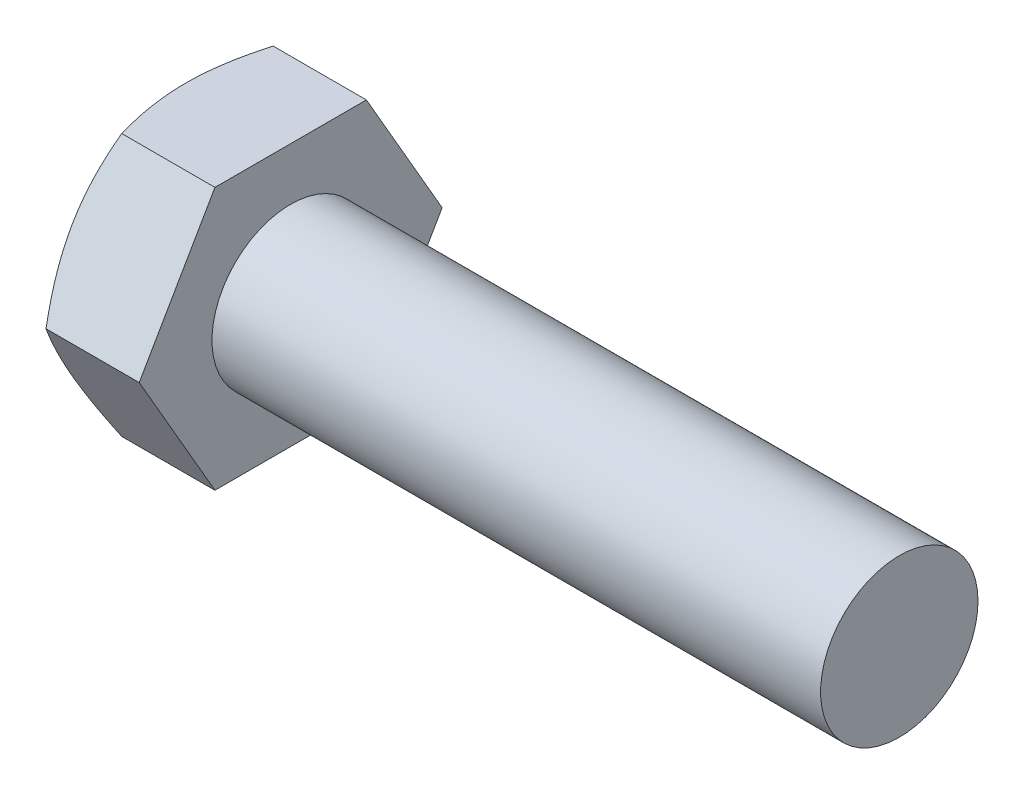
ISO-10303-21;
HEADER;
FILE_DESCRIPTION(('STEP AP214'),'2;1');
FILE_NAME('part.step','',(''),(''),'','','');
FILE_SCHEMA(('AUTOMOTIVE_DESIGN { 1 0 10303 214 1 1 1 1 }'));
ENDSEC;
DATA;
#1=APPLICATION_CONTEXT('core data for automotive mechanical design processes');
#2=APPLICATION_PROTOCOL_DEFINITION('international standard','automotive_design',2000,#1);
#3=PRODUCT_CONTEXT('',#1,'mechanical');
#4=PRODUCT('Part','Part','',(#3));
#5=PRODUCT_RELATED_PRODUCT_CATEGORY('part','',(#4));
#6=PRODUCT_DEFINITION_FORMATION('','',#4);
#7=PRODUCT_DEFINITION_CONTEXT('part definition',#1,'design');
#8=PRODUCT_DEFINITION('design','',#6,#7);
#9=PRODUCT_DEFINITION_SHAPE('','',#8);
#10=(LENGTH_UNIT() NAMED_UNIT(*) SI_UNIT(.MILLI.,.METRE.));
#11=(NAMED_UNIT(*) PLANE_ANGLE_UNIT() SI_UNIT($,.RADIAN.));
#12=(NAMED_UNIT(*) SI_UNIT($,.STERADIAN.) SOLID_ANGLE_UNIT());
#13=UNCERTAINTY_MEASURE_WITH_UNIT(LENGTH_MEASURE(1.E-05),#10,'distance_accuracy_value','');
#14=(GEOMETRIC_REPRESENTATION_CONTEXT(3) GLOBAL_UNCERTAINTY_ASSIGNED_CONTEXT((#13)) GLOBAL_UNIT_ASSIGNED_CONTEXT((#10,
#11,#12)) REPRESENTATION_CONTEXT('',''));
#15=CARTESIAN_POINT('',(0.,0.,0.));
#16=DIRECTION('',(0.,0.,1.));
#17=DIRECTION('',(1.,0.,0.));
#18=AXIS2_PLACEMENT_3D('',#15,#16,#17);
#19=CARTESIAN_POINT('',(23.2,0.,0.));
#20=DIRECTION('',(-1.,0.,0.));
#21=DIRECTION('',(0.,0.,1.));
#22=AXIS2_PLACEMENT_3D('',#19,#20,#21);
#23=CYLINDRICAL_SURFACE('',#22,3.);
#24=CARTESIAN_POINT('',(23.2,0.,0.));
#25=DIRECTION('',(1.,0.,0.));
#26=DIRECTION('',(0.,0.,-1.));
#27=AXIS2_PLACEMENT_3D('',#24,#25,#26);
#28=CIRCLE('',#27,3.);
#29=CARTESIAN_POINT('',(23.2,0.,-3.));
#30=VERTEX_POINT('',#29);
#31=EDGE_CURVE('E150',#30,#30,#28,.T.);
#32=ORIENTED_EDGE('',*,*,#31,.F.);
#33=EDGE_LOOP('',(#32));
#34=FACE_BOUND('',#33,.T.);
#35=CARTESIAN_POINT('',(0.,0.,0.));
#36=DIRECTION('',(1.,0.,0.));
#37=DIRECTION('',(0.,0.,-1.));
#38=AXIS2_PLACEMENT_3D('',#35,#36,#37);
#39=CIRCLE('',#38,3.);
#40=CARTESIAN_POINT('',(0.,0.,-3.));
#41=VERTEX_POINT('',#40);
#42=EDGE_CURVE('E149',#41,#41,#39,.T.);
#43=ORIENTED_EDGE('',*,*,#42,.T.);
#44=EDGE_LOOP('',(#43));
#45=FACE_BOUND('',#44,.T.);
#46=ADVANCED_FACE('F43',(#34,#45),#23,.T.);
#47=CARTESIAN_POINT('',(23.2,0.,0.));
#48=DIRECTION('',(1.,0.,0.));
#49=DIRECTION('',(0.,0.,-1.));
#50=AXIS2_PLACEMENT_3D('',#47,#48,#49);
#51=PLANE('',#50);
#52=ORIENTED_EDGE('',*,*,#31,.T.);
#53=EDGE_LOOP('',(#52));
#54=FACE_BOUND('',#53,.T.);
#55=ADVANCED_FACE('F269',(#54),#51,.T.);
#56=CARTESIAN_POINT('',(-4.,-5.,2.88675134594813));
#57=DIRECTION('',(0.,0.5,-0.866025403784439));
#58=DIRECTION('',(0.,0.866025403784439,0.5));
#59=AXIS2_PLACEMENT_3D('',#56,#57,#58);
#60=PLANE('',#59);
#61=DIRECTION('',(1.,0.,0.));
#62=VECTOR('',#61,1.);
#63=CARTESIAN_POINT('',(-4.,0.,5.77350269189626));
#64=LINE('',#63,#62);
#65=CARTESIAN_POINT('',(-3.5534180126148,0.,5.77350269189626));
#66=VERTEX_POINT('',#65);
#67=CARTESIAN_POINT('',(0.,0.,5.77350269189626));
#68=VERTEX_POINT('',#67);
#69=EDGE_CURVE('E147',#66,#68,#64,.T.);
#70=ORIENTED_EDGE('',*,*,#69,.F.);
#71=CARTESIAN_POINT('',(-3.55335134394818,0.00020000000000018,5.7736181619501));
#72=CARTESIAN_POINT('',(-3.62661343236237,-0.219534594525185,5.64675433465071));
#73=CARTESIAN_POINT('',(-3.69324867808191,-0.44114858445958,5.5188054379059));
#74=CARTESIAN_POINT('',(-3.80956100898919,-0.888213995453513,5.26069210252318));
#75=CARTESIAN_POINT('',(-3.85919695008421,-1.11367335959077,5.13052307794721));
#76=CARTESIAN_POINT('',(-3.9364489745813,-1.56183230522351,4.87177839004641));
#77=CARTESIAN_POINT('',(-3.96457962171651,-1.78446209310419,4.74324302208387));
#78=CARTESIAN_POINT('',(-3.98980507804631,-2.11918990184664,4.54998783160116));
#79=CARTESIAN_POINT('',(-3.99538654023052,-2.23084219680506,4.48552534905128));
#80=CARTESIAN_POINT('',(-4.00079778324853,-2.4542499706738,4.35654081066911));
#81=CARTESIAN_POINT('',(-4.0006277417418,-2.56600544629031,4.2920187567385));
#82=CARTESIAN_POINT('',(-3.99224636820796,-2.87218423085064,4.11524635305244));
#83=CARTESIAN_POINT('',(-3.97817022810275,-3.06650608596721,4.00305457769146));
#84=CARTESIAN_POINT('',(-3.93353474289057,-3.4538601019977,3.77941563226458));
#85=CARTESIAN_POINT('',(-3.90296013985249,-3.64689090137157,3.66796924828419));
#86=CARTESIAN_POINT('',(-3.82653150637884,-4.03502534247485,3.44387972423144));
#87=CARTESIAN_POINT('',(-3.78035362112132,-4.23007999864174,3.3312648659868));
#88=CARTESIAN_POINT('',(-3.67554820550807,-4.61728034535877,3.10771464157941));
#89=CARTESIAN_POINT('',(-3.61694529656263,-4.80943099540809,2.99677641204847));
#90=CARTESIAN_POINT('',(-3.55335134394818,-5.0002,2.88663587589429));
#91=B_SPLINE_CURVE_WITH_KNOTS('',3,(#71,#72,#73,#74,#75,#76,#77,#78,#79,#80,#81,#82,#83,#84,#85,
#86,#87,#88,#89,#90),.UNSPECIFIED.,.F.,.F.,(4,2,2,2,2,2,2,2,2,4),(0.,0.792555841363089,
1.58701660053333,2.3618153748728,2.74884076077325,3.13585419177295,3.80962362599679,
4.48401723901189,5.17336882348929,5.86136694793725),.UNSPECIFIED.);
#92=CARTESIAN_POINT('',(-4.,-2.5,4.33012701892219));
#93=VERTEX_POINT('',#92);
#94=EDGE_CURVE('E131',#66,#93,#91,.T.);
#95=ORIENTED_EDGE('',*,*,#94,.T.);
#96=CARTESIAN_POINT('',(-3.5534180126148,-5.,2.88675134594812));
#97=VERTEX_POINT('',#96);
#98=EDGE_CURVE('E198',#93,#97,#91,.T.);
#99=ORIENTED_EDGE('',*,*,#98,.T.);
#100=DIRECTION('',(1.,0.,0.));
#101=VECTOR('',#100,1.);
#102=CARTESIAN_POINT('',(-4.,-5.,2.88675134594813));
#103=LINE('',#102,#101);
#104=CARTESIAN_POINT('',(0.,-5.,2.88675134594813));
#105=VERTEX_POINT('',#104);
#106=EDGE_CURVE('E142',#97,#105,#103,.T.);
#107=ORIENTED_EDGE('',*,*,#106,.T.);
#108=DIRECTION('',(0.,0.866025403784439,0.5));
#109=VECTOR('',#108,1.);
#110=CARTESIAN_POINT('',(0.,-5.,2.88675134594813));
#111=LINE('',#110,#109);
#112=EDGE_CURVE('E166',#105,#68,#111,.T.);
#113=ORIENTED_EDGE('',*,*,#112,.T.);
#114=EDGE_LOOP('',(#70,#95,#99,#107,#113));
#115=FACE_BOUND('',#114,.T.);
#116=ADVANCED_FACE('F196',(#115),#60,.F.);
#117=CARTESIAN_POINT('',(-4.,0.,5.77350269189626));
#118=DIRECTION('',(0.,-0.5,-0.866025403784439));
#119=DIRECTION('',(0.,0.866025403784439,-0.5));
#120=AXIS2_PLACEMENT_3D('',#117,#118,#119);
#121=PLANE('',#120);
#122=DIRECTION('',(1.,0.,0.));
#123=VECTOR('',#122,1.);
#124=CARTESIAN_POINT('',(-4.,5.,2.88675134594813));
#125=LINE('',#124,#123);
#126=CARTESIAN_POINT('',(-3.5534180126148,5.,2.88675134594812));
#127=VERTEX_POINT('',#126);
#128=CARTESIAN_POINT('',(0.,5.,2.88675134594813));
#129=VERTEX_POINT('',#128);
#130=EDGE_CURVE('E140',#127,#129,#125,.T.);
#131=ORIENTED_EDGE('',*,*,#130,.F.);
#132=CARTESIAN_POINT('',(-3.55335134394818,5.0002,2.88663587589429));
#133=CARTESIAN_POINT('',(-3.62661343236237,4.78046540547482,3.01349970319368));
#134=CARTESIAN_POINT('',(-3.69324867808191,4.55885141554042,3.14144859993849));
#135=CARTESIAN_POINT('',(-3.80956100898919,4.11178600454649,3.39956193532121));
#136=CARTESIAN_POINT('',(-3.85919695008421,3.88632664040923,3.52973095989718));
#137=CARTESIAN_POINT('',(-3.9364489745813,3.43816769477649,3.78847564779798));
#138=CARTESIAN_POINT('',(-3.96457962171651,3.21553790689581,3.91701101576052));
#139=CARTESIAN_POINT('',(-3.98980507804631,2.88081009815336,4.11026620624322));
#140=CARTESIAN_POINT('',(-3.99538654023052,2.76915780319494,4.17472868879311));
#141=CARTESIAN_POINT('',(-4.00079778324853,2.54575002932621,4.30371322717528));
#142=CARTESIAN_POINT('',(-4.0006277417418,2.43399455370969,4.36823528110589));
#143=CARTESIAN_POINT('',(-3.99224636820796,2.12781576914936,4.54500768479194));
#144=CARTESIAN_POINT('',(-3.97817022810275,1.93349391403279,4.65719946015292));
#145=CARTESIAN_POINT('',(-3.93353474289057,1.5461398980023,4.88083840557981));
#146=CARTESIAN_POINT('',(-3.90296013985249,1.35310909862843,4.9922847895602));
#147=CARTESIAN_POINT('',(-3.82653150637884,0.964974657525146,5.21637431361295));
#148=CARTESIAN_POINT('',(-3.78035362112132,0.769920001358265,5.32898917185759));
#149=CARTESIAN_POINT('',(-3.67554820550807,0.382719654641232,5.55253939626498));
#150=CARTESIAN_POINT('',(-3.61694529656263,0.190569004591914,5.66347762579592));
#151=CARTESIAN_POINT('',(-3.55335134394818,-0.000199999999999711,5.7736181619501));
#152=B_SPLINE_CURVE_WITH_KNOTS('',3,(#132,#133,#134,#135,#136,#137,#138,#139,#140,#141,#142,
#143,#144,#145,#146,#147,#148,#149,#150,#151),.UNSPECIFIED.,.F.,.F.,(4,2,2,2,2,2,2,2,2,4),(0.,
0.79255584136309,1.58701660053333,2.3618153748728,2.74884076077325,3.13585419177294,
3.80962362599679,4.48401723901189,5.17336882348928,5.86136694793725),.UNSPECIFIED.);
#153=CARTESIAN_POINT('',(-4.,2.5,4.33012701892219));
#154=VERTEX_POINT('',#153);
#155=EDGE_CURVE('E255',#127,#154,#152,.T.);
#156=ORIENTED_EDGE('',*,*,#155,.T.);
#157=EDGE_CURVE('E120',#154,#66,#152,.T.);
#158=ORIENTED_EDGE('',*,*,#157,.T.);
#159=ORIENTED_EDGE('',*,*,#69,.T.);
#160=DIRECTION('',(0.,0.866025403784439,-0.5));
#161=VECTOR('',#160,1.);
#162=CARTESIAN_POINT('',(0.,0.,5.77350269189626));
#163=LINE('',#162,#161);
#164=EDGE_CURVE('E171',#68,#129,#163,.T.);
#165=ORIENTED_EDGE('',*,*,#164,.T.);
#166=EDGE_LOOP('',(#131,#156,#158,#159,#165));
#167=FACE_BOUND('',#166,.T.);
#168=ADVANCED_FACE('F208',(#167),#121,.F.);
#169=CARTESIAN_POINT('',(-4.,5.,2.88675134594813));
#170=DIRECTION('',(0.,-1.,0.));
#171=DIRECTION('',(0.,0.,-1.));
#172=AXIS2_PLACEMENT_3D('',#169,#170,#171);
#173=PLANE('',#172);
#174=DIRECTION('',(1.,0.,0.));
#175=VECTOR('',#174,1.);
#176=CARTESIAN_POINT('',(-4.,5.,-2.88675134594813));
#177=LINE('',#176,#175);
#178=CARTESIAN_POINT('',(-3.5534180126148,5.,-2.88675134594813));
#179=VERTEX_POINT('',#178);
#180=CARTESIAN_POINT('',(0.,5.,-2.88675134594813));
#181=VERTEX_POINT('',#180);
#182=EDGE_CURVE('E137',#179,#181,#177,.T.);
#183=ORIENTED_EDGE('',*,*,#182,.F.);
#184=CARTESIAN_POINT('',(-1.10452353026787,5.,-8.67769989901018));
#185=CARTESIAN_POINT('',(-1.208411678307,5.,-8.46999549957049));
#186=CARTESIAN_POINT('',(-1.31158263221653,5.,-8.26192857152029));
#187=CARTESIAN_POINT('',(-1.51614356461214,5.,-7.84490442766506));
#188=CARTESIAN_POINT('',(-1.61753342363025,5.,-7.63594715329878));
#189=CARTESIAN_POINT('',(-1.81837386700251,5.,-7.2165824620712));
#190=CARTESIAN_POINT('',(-1.91782012916567,5.,-7.00617297083903));
#191=CARTESIAN_POINT('',(-2.11408085398133,5.,-6.58413282248084));
#192=CARTESIAN_POINT('',(-2.21089536817885,5.,-6.37250218937048));
#193=CARTESIAN_POINT('',(-2.40556869365117,5.,-5.93822918094828));
#194=CARTESIAN_POINT('',(-2.50327849061294,5.,-5.71551978557233));
#195=CARTESIAN_POINT('',(-2.69424698877124,5.,-5.26820250921387));
#196=CARTESIAN_POINT('',(-2.78750584516144,5.,-5.04359469474662));
#197=CARTESIAN_POINT('',(-2.9683245579508,5.,-4.59223463012096));
#198=CARTESIAN_POINT('',(-3.05588769993606,5.,-4.36548370425787));
#199=CARTESIAN_POINT('',(-3.22378244712704,5.,-3.90933222338445));
#200=CARTESIAN_POINT('',(-3.30411484466864,5.,-3.67993196180087));
#201=CARTESIAN_POINT('',(-3.4732919444061,5.,-3.16390484606838));
#202=CARTESIAN_POINT('',(-3.5597158711951,5.,-2.87647211871409));
#203=CARTESIAN_POINT('',(-3.71355971006833,5.,-2.29642431473556));
#204=CARTESIAN_POINT('',(-3.78098132997756,5.,-2.0038097063448));
#205=CARTESIAN_POINT('',(-3.86312218276578,5.,-1.5639187607611));
#206=CARTESIAN_POINT('',(-3.8872097352011,5.,-1.41837577964727));
#207=CARTESIAN_POINT('',(-3.92878586653768,5.,-1.12635842901189));
#208=CARTESIAN_POINT('',(-3.94627539907545,5.,-0.979884197201749));
#209=CARTESIAN_POINT('',(-3.97413236405401,5.,-0.686297290424494));
#210=CARTESIAN_POINT('',(-3.98450184744371,5.,-0.539184811603662));
#211=CARTESIAN_POINT('',(-3.99779052304872,5.,-0.244620623595926));
#212=CARTESIAN_POINT('',(-4.00070974658335,5.,-0.0971689158376774));
#213=CARTESIAN_POINT('',(-3.99899344261343,5.,0.198573402575844));
#214=CARTESIAN_POINT('',(-3.99431256971376,5.,0.34686374918098));
#215=CARTESIAN_POINT('',(-3.97747027318881,5.,0.643014838668123));
#216=CARTESIAN_POINT('',(-3.96530881632949,5.,0.790875579638588));
#217=CARTESIAN_POINT('',(-3.93389230888484,5.,1.0858920423211));
#218=CARTESIAN_POINT('',(-3.91463457364898,5.,1.23304747583125));
#219=CARTESIAN_POINT('',(-3.86959263924468,5.,1.52634780050896));
#220=CARTESIAN_POINT('',(-3.84380821166372,5.,1.67249265612574));
#221=CARTESIAN_POINT('',(-3.75668256988163,5.,2.11408994754182));
#222=CARTESIAN_POINT('',(-3.68613563774428,5.,2.40773999823979));
#223=CARTESIAN_POINT('',(-3.52649261863847,5.,2.98996510032815));
#224=CARTESIAN_POINT('',(-3.43738610188606,5.,3.2785371987903));
#225=CARTESIAN_POINT('',(-3.26587062387847,5.,3.790241794612));
#226=CARTESIAN_POINT('',(-3.18605773283768,5.,4.01425747334157));
#227=CARTESIAN_POINT('',(-3.01978602799213,5.,4.45972536136056));
#228=CARTESIAN_POINT('',(-2.93332904329826,5.,4.6811782570017));
#229=CARTESIAN_POINT('',(-2.75511770374832,5.,5.12210633953825));
#230=CARTESIAN_POINT('',(-2.66335976385622,5.,5.34158006915495));
#231=CARTESIAN_POINT('',(-2.47568479264989,5.,5.77874375147833));
#232=CARTESIAN_POINT('',(-2.37976763007032,5.,5.99643364762894));
#233=CARTESIAN_POINT('',(-2.18872983291713,5.,6.4211505710805));
#234=CARTESIAN_POINT('',(-2.09374666202136,5.,6.62823962150207));
#235=CARTESIAN_POINT('',(-1.90129295898707,5.,7.04125269120469));
#236=CARTESIAN_POINT('',(-1.80382246544803,5.,7.24717672850447));
#237=CARTESIAN_POINT('',(-1.6070113926853,5.,7.65767872257997));
#238=CARTESIAN_POINT('',(-1.50767443156455,5.,7.86225841752673));
#239=CARTESIAN_POINT('',(-1.30729574837575,5.,8.27057470184742));
#240=CARTESIAN_POINT('',(-1.20625407390076,5.,8.47431131456183));
#241=CARTESIAN_POINT('',(-1.10452353026787,5.,8.67769989901018));
#242=B_SPLINE_CURVE_WITH_KNOTS('',3,(#184,#185,#186,#187,#188,#189,#190,#191,#192,#193,#194,
#195,#196,#197,#198,#199,#200,#201,#202,#203,#204,#205,#206,#207,#208,#209,#210,#211,#212,#213,
#214,#215,#216,#217,#218,#219,#220,#221,#222,#223,#224,#225,#226,#227,#228,#229,#230,#231,#232,
#233,#234,#235,#236,#237,#238,#239,#240,#241),.UNSPECIFIED.,.F.,.F.,(4,2,2,2,2,2,2,2,2,2,2,2,2,
2,2,2,2,2,2,2,2,2,2,2,2,2,2,2,4),(0.,0.69671365657365,1.39347386853974,2.09163890900885,
2.78979026545806,3.51935463562382,4.24889354901043,4.97800782414732,5.70704210634686,
6.6070202336335,7.50691744992128,7.94935972093777,8.39173801959499,8.83398883650023,
9.27623779427301,9.7211351062603,10.1660343948096,10.6111021699031,11.0561855230418,
11.9612951407398,12.8669147747757,13.58021856303,14.2933266782872,15.0069228464768,
15.720541552222,16.4040197454066,17.0874873384909,17.7697443652452,18.4519823758207),.UNSPECIFIED.);
#243=CARTESIAN_POINT('',(-4.,5.,0.));
#244=VERTEX_POINT('',#243);
#245=EDGE_CURVE('E174',#179,#244,#242,.T.);
#246=ORIENTED_EDGE('',*,*,#245,.T.);
#247=EDGE_CURVE('E179',#244,#127,#242,.T.);
#248=ORIENTED_EDGE('',*,*,#247,.T.);
#249=ORIENTED_EDGE('',*,*,#130,.T.);
#250=DIRECTION('',(0.,0.,-1.));
#251=VECTOR('',#250,1.);
#252=CARTESIAN_POINT('',(0.,5.,2.88675134594813));
#253=LINE('',#252,#251);
#254=EDGE_CURVE('E176',#129,#181,#253,.T.);
#255=ORIENTED_EDGE('',*,*,#254,.T.);
#256=EDGE_LOOP('',(#183,#246,#248,#249,#255));
#257=FACE_BOUND('',#256,.T.);
#258=ADVANCED_FACE('F203',(#257),#173,.F.);
#259=CARTESIAN_POINT('',(-4.,5.,-2.88675134594813));
#260=DIRECTION('',(0.,-0.5,0.866025403784439));
#261=DIRECTION('',(0.,-0.866025403784439,-0.5));
#262=AXIS2_PLACEMENT_3D('',#259,#260,#261);
#263=PLANE('',#262);
#264=DIRECTION('',(1.,0.,0.));
#265=VECTOR('',#264,1.);
#266=CARTESIAN_POINT('',(-4.,0.,-5.77350269189626));
#267=LINE('',#266,#265);
#268=CARTESIAN_POINT('',(-3.5534180126148,0.,-5.77350269189626));
#269=VERTEX_POINT('',#268);
#270=CARTESIAN_POINT('',(0.,0.,-5.77350269189626));
#271=VERTEX_POINT('',#270);
#272=EDGE_CURVE('E128',#269,#271,#267,.T.);
#273=ORIENTED_EDGE('',*,*,#272,.F.);
#274=CARTESIAN_POINT('',(-3.55335134394818,-0.000199999999999485,-5.77361816195009));
#275=CARTESIAN_POINT('',(-3.62661343236237,0.219534594525186,-5.6467543346507));
#276=CARTESIAN_POINT('',(-3.69324867808191,0.441148584459581,-5.51880543790589));
#277=CARTESIAN_POINT('',(-3.80956100898919,0.888213995453513,-5.26069210252318));
#278=CARTESIAN_POINT('',(-3.85919695008421,1.11367335959077,-5.13052307794721));
#279=CARTESIAN_POINT('',(-3.9364489745813,1.56183230522351,-4.87177839004641));
#280=CARTESIAN_POINT('',(-3.96457962171651,1.78446209310419,-4.74324302208387));
#281=CARTESIAN_POINT('',(-3.98980507804632,2.11918990184664,-4.54998783160116));
#282=CARTESIAN_POINT('',(-3.99538654023052,2.23084219680506,-4.48552534905128));
#283=CARTESIAN_POINT('',(-4.00079778324853,2.45424997067379,-4.35654081066911));
#284=CARTESIAN_POINT('',(-4.0006277417418,2.56600544629031,-4.2920187567385));
#285=CARTESIAN_POINT('',(-3.99224636820796,2.87218423085064,-4.11524635305244));
#286=CARTESIAN_POINT('',(-3.97817022810275,3.06650608596721,-4.00305457769146));
#287=CARTESIAN_POINT('',(-3.93353474289057,3.4538601019977,-3.77941563226457));
#288=CARTESIAN_POINT('',(-3.90296013985249,3.64689090137157,-3.66796924828418));
#289=CARTESIAN_POINT('',(-3.82653150637884,4.03502534247485,-3.44387972423144));
#290=CARTESIAN_POINT('',(-3.78035362112132,4.23007999864173,-3.3312648659868));
#291=CARTESIAN_POINT('',(-3.67554820550807,4.61728034535877,-3.1077146415794));
#292=CARTESIAN_POINT('',(-3.61694529656263,4.80943099540809,-2.99677641204847));
#293=CARTESIAN_POINT('',(-3.55335134394818,5.0002,-2.88663587589429));
#294=B_SPLINE_CURVE_WITH_KNOTS('',3,(#274,#275,#276,#277,#278,#279,#280,#281,#282,#283,#284,
#285,#286,#287,#288,#289,#290,#291,#292,#293),.UNSPECIFIED.,.F.,.F.,(4,2,2,2,2,2,2,2,2,4),(0.,
0.792555841363089,1.58701660053333,2.3618153748728,2.74884076077325,3.13585419177294,
3.80962362599679,4.48401723901189,5.17336882348928,5.86136694793725),.UNSPECIFIED.);
#295=CARTESIAN_POINT('',(-4.,2.5,-4.33012701892219));
#296=VERTEX_POINT('',#295);
#297=EDGE_CURVE('E112',#269,#296,#294,.T.);
#298=ORIENTED_EDGE('',*,*,#297,.T.);
#299=EDGE_CURVE('E122',#296,#179,#294,.T.);
#300=ORIENTED_EDGE('',*,*,#299,.T.);
#301=ORIENTED_EDGE('',*,*,#182,.T.);
#302=DIRECTION('',(0.,-0.866025403784439,-0.5));
#303=VECTOR('',#302,1.);
#304=CARTESIAN_POINT('',(0.,5.,-2.88675134594813));
#305=LINE('',#304,#303);
#306=EDGE_CURVE('E135',#181,#271,#305,.T.);
#307=ORIENTED_EDGE('',*,*,#306,.T.);
#308=EDGE_LOOP('',(#273,#298,#300,#301,#307));
#309=FACE_BOUND('',#308,.T.);
#310=ADVANCED_FACE('F133',(#309),#263,.F.);
#311=CARTESIAN_POINT('',(-4.,0.,-5.77350269189626));
#312=DIRECTION('',(0.,0.5,0.866025403784439));
#313=DIRECTION('',(0.,-0.866025403784439,0.5));
#314=AXIS2_PLACEMENT_3D('',#311,#312,#313);
#315=PLANE('',#314);
#316=DIRECTION('',(1.,0.,0.));
#317=VECTOR('',#316,1.);
#318=CARTESIAN_POINT('',(-4.,-5.,-2.88675134594813));
#319=LINE('',#318,#317);
#320=CARTESIAN_POINT('',(-3.5534180126148,-5.,-2.88675134594813));
#321=VERTEX_POINT('',#320);
#322=CARTESIAN_POINT('',(0.,-5.,-2.88675134594813));
#323=VERTEX_POINT('',#322);
#324=EDGE_CURVE('E138',#321,#323,#319,.T.);
#325=ORIENTED_EDGE('',*,*,#324,.F.);
#326=CARTESIAN_POINT('',(-3.55335134394818,-5.0002,-2.88663587589429));
#327=CARTESIAN_POINT('',(-3.62661343236237,-4.78046540547482,-3.01349970319368));
#328=CARTESIAN_POINT('',(-3.69324867808191,-4.55885141554042,-3.14144859993849));
#329=CARTESIAN_POINT('',(-3.80956100898919,-4.11178600454649,-3.39956193532121));
#330=CARTESIAN_POINT('',(-3.85919695008421,-3.88632664040923,-3.52973095989717));
#331=CARTESIAN_POINT('',(-3.9364489745813,-3.43816769477649,-3.78847564779797));
#332=CARTESIAN_POINT('',(-3.96457962171651,-3.21553790689581,-3.91701101576052));
#333=CARTESIAN_POINT('',(-3.98980507804632,-2.88081009815336,-4.11026620624322));
#334=CARTESIAN_POINT('',(-3.99538654023052,-2.76915780319494,-4.1747286887931));
#335=CARTESIAN_POINT('',(-4.00079778324853,-2.54575002932621,-4.30371322717527));
#336=CARTESIAN_POINT('',(-4.0006277417418,-2.43399455370969,-4.36823528110588));
#337=CARTESIAN_POINT('',(-3.99224636820796,-2.12781576914936,-4.54500768479194));
#338=CARTESIAN_POINT('',(-3.97817022810275,-1.93349391403279,-4.65719946015292));
#339=CARTESIAN_POINT('',(-3.93353474289057,-1.5461398980023,-4.88083840557981));
#340=CARTESIAN_POINT('',(-3.90296013985249,-1.35310909862843,-4.9922847895602));
#341=CARTESIAN_POINT('',(-3.82653150637884,-0.964974657525146,-5.21637431361294));
#342=CARTESIAN_POINT('',(-3.78035362112132,-0.769920001358265,-5.32898917185758));
#343=CARTESIAN_POINT('',(-3.67554820550807,-0.382719654641232,-5.55253939626498));
#344=CARTESIAN_POINT('',(-3.61694529656263,-0.190569004591913,-5.66347762579592));
#345=CARTESIAN_POINT('',(-3.55335134394818,0.000200000000000467,-5.77361816195009));
#346=B_SPLINE_CURVE_WITH_KNOTS('',3,(#326,#327,#328,#329,#330,#331,#332,#333,#334,#335,#336,
#337,#338,#339,#340,#341,#342,#343,#344,#345),.UNSPECIFIED.,.F.,.F.,(4,2,2,2,2,2,2,2,2,4),(0.,
0.79255584136309,1.58701660053333,2.3618153748728,2.74884076077325,3.13585419177294,
3.80962362599679,4.48401723901189,5.17336882348928,5.86136694793725),.UNSPECIFIED.);
#347=CARTESIAN_POINT('',(-4.,-2.5,-4.33012701892219));
#348=VERTEX_POINT('',#347);
#349=EDGE_CURVE('E130',#321,#348,#346,.T.);
#350=ORIENTED_EDGE('',*,*,#349,.T.);
#351=EDGE_CURVE('E65',#348,#269,#346,.T.);
#352=ORIENTED_EDGE('',*,*,#351,.T.);
#353=ORIENTED_EDGE('',*,*,#272,.T.);
#354=DIRECTION('',(0.,-0.866025403784439,0.5));
#355=VECTOR('',#354,1.);
#356=CARTESIAN_POINT('',(0.,0.,-5.77350269189626));
#357=LINE('',#356,#355);
#358=EDGE_CURVE('E192',#271,#323,#357,.T.);
#359=ORIENTED_EDGE('',*,*,#358,.T.);
#360=EDGE_LOOP('',(#325,#350,#352,#353,#359));
#361=FACE_BOUND('',#360,.T.);
#362=ADVANCED_FACE('F126',(#361),#315,.F.);
#363=CARTESIAN_POINT('',(-4.,-5.,-2.88675134594813));
#364=DIRECTION('',(0.,1.,0.));
#365=DIRECTION('',(0.,0.,1.));
#366=AXIS2_PLACEMENT_3D('',#363,#364,#365);
#367=PLANE('',#366);
#368=ORIENTED_EDGE('',*,*,#106,.F.);
#369=CARTESIAN_POINT('',(-1.10452353026787,-5.,8.67769989901018));
#370=CARTESIAN_POINT('',(-1.208411678307,-5.,8.46999549957049));
#371=CARTESIAN_POINT('',(-1.31158263221653,-5.,8.26192857152029));
#372=CARTESIAN_POINT('',(-1.51614356461214,-5.,7.84490442766506));
#373=CARTESIAN_POINT('',(-1.61753342363025,-5.,7.63594715329879));
#374=CARTESIAN_POINT('',(-1.81837386700251,-5.,7.2165824620712));
#375=CARTESIAN_POINT('',(-1.91782012916567,-5.,7.00617297083903));
#376=CARTESIAN_POINT('',(-2.11408085398133,-5.,6.58413282248085));
#377=CARTESIAN_POINT('',(-2.21089536817885,-5.,6.37250218937049));
#378=CARTESIAN_POINT('',(-2.40556869365117,-5.,5.93822918094828));
#379=CARTESIAN_POINT('',(-2.50327849061294,-5.,5.71551978557233));
#380=CARTESIAN_POINT('',(-2.69424698877124,-5.,5.26820250921388));
#381=CARTESIAN_POINT('',(-2.78750584516144,-5.,5.04359469474662));
#382=CARTESIAN_POINT('',(-2.9683245579508,-5.,4.59223463012096));
#383=CARTESIAN_POINT('',(-3.05588769993605,-5.,4.36548370425788));
#384=CARTESIAN_POINT('',(-3.22378244712704,-5.,3.90933222338445));
#385=CARTESIAN_POINT('',(-3.30411484466864,-5.,3.67993196180087));
#386=CARTESIAN_POINT('',(-3.4732919444061,-5.,3.16390484606839));
#387=CARTESIAN_POINT('',(-3.5597158711951,-5.,2.8764721187141));
#388=CARTESIAN_POINT('',(-3.71355971006833,-5.,2.29642431473557));
#389=CARTESIAN_POINT('',(-3.78098132997756,-5.,2.0038097063448));
#390=CARTESIAN_POINT('',(-3.86312218276578,-5.,1.5639187607611));
#391=CARTESIAN_POINT('',(-3.8872097352011,-5.,1.41837577964727));
#392=CARTESIAN_POINT('',(-3.92878586653768,-5.,1.12635842901189));
#393=CARTESIAN_POINT('',(-3.94627539907545,-5.,0.979884197201751));
#394=CARTESIAN_POINT('',(-3.97413236405401,-5.,0.686297290424497));
#395=CARTESIAN_POINT('',(-3.98450184744371,-5.,0.539184811603665));
#396=CARTESIAN_POINT('',(-3.99779052304871,-5.,0.244620623595929));
#397=CARTESIAN_POINT('',(-4.00070974658335,-5.,0.0971689158376794));
#398=CARTESIAN_POINT('',(-3.99899344261343,-5.,-0.198573402575841));
#399=CARTESIAN_POINT('',(-3.99431256971376,-5.,-0.346863749180977));
#400=CARTESIAN_POINT('',(-3.97747027318881,-5.,-0.64301483866812));
#401=CARTESIAN_POINT('',(-3.96530881632949,-5.,-0.790875579638584));
#402=CARTESIAN_POINT('',(-3.93389230888484,-5.,-1.08589204232109));
#403=CARTESIAN_POINT('',(-3.91463457364898,-5.,-1.23304747583124));
#404=CARTESIAN_POINT('',(-3.86959263924468,-5.,-1.52634780050896));
#405=CARTESIAN_POINT('',(-3.84380821166372,-5.,-1.67249265612574));
#406=CARTESIAN_POINT('',(-3.75668256988163,-5.,-2.11408994754182));
#407=CARTESIAN_POINT('',(-3.68613563774428,-5.,-2.40773999823979));
#408=CARTESIAN_POINT('',(-3.52649261863847,-5.,-2.98996510032815));
#409=CARTESIAN_POINT('',(-3.43738610188606,-5.,-3.2785371987903));
#410=CARTESIAN_POINT('',(-3.26587062387847,-5.,-3.79024179461199));
#411=CARTESIAN_POINT('',(-3.18605773283768,-5.,-4.01425747334156));
#412=CARTESIAN_POINT('',(-3.01978602799213,-5.,-4.45972536136055));
#413=CARTESIAN_POINT('',(-2.93332904329826,-5.,-4.6811782570017));
#414=CARTESIAN_POINT('',(-2.75511770374832,-5.,-5.12210633953825));
#415=CARTESIAN_POINT('',(-2.66335976385622,-5.,-5.34158006915495));
#416=CARTESIAN_POINT('',(-2.47568479264989,-5.,-5.77874375147833));
#417=CARTESIAN_POINT('',(-2.37976763007032,-5.,-5.99643364762894));
#418=CARTESIAN_POINT('',(-2.18872983291713,-5.,-6.4211505710805));
#419=CARTESIAN_POINT('',(-2.09374666202136,-5.,-6.62823962150207));
#420=CARTESIAN_POINT('',(-1.90129295898708,-5.,-7.04125269120469));
#421=CARTESIAN_POINT('',(-1.80382246544803,-5.,-7.24717672850447));
#422=CARTESIAN_POINT('',(-1.6070113926853,-5.,-7.65767872257996));
#423=CARTESIAN_POINT('',(-1.50767443156454,-5.,-7.86225841752673));
#424=CARTESIAN_POINT('',(-1.30729574837575,-5.,-8.27057470184742));
#425=CARTESIAN_POINT('',(-1.20625407390076,-5.,-8.47431131456183));
#426=CARTESIAN_POINT('',(-1.10452353026786,-5.,-8.67769989901018));
#427=B_SPLINE_CURVE_WITH_KNOTS('',3,(#369,#370,#371,#372,#373,#374,#375,#376,#377,#378,#379,
#380,#381,#382,#383,#384,#385,#386,#387,#388,#389,#390,#391,#392,#393,#394,#395,#396,#397,#398,
#399,#400,#401,#402,#403,#404,#405,#406,#407,#408,#409,#410,#411,#412,#413,#414,#415,#416,#417,
#418,#419,#420,#421,#422,#423,#424,#425,#426),.UNSPECIFIED.,.F.,.F.,(4,2,2,2,2,2,2,2,2,2,2,2,2,
2,2,2,2,2,2,2,2,2,2,2,2,2,2,2,4),(0.,0.696713656573651,1.39347386853974,2.09163890900886,
2.78979026545806,3.51935463562382,4.24889354901044,4.97800782414732,5.70704210634686,
6.60702023363351,7.50691744992128,7.94935972093777,8.391738019595,8.83398883650024,
9.27623779427302,9.7211351062603,10.1660343948096,10.6111021699031,11.0561855230418,
11.9612951407398,12.8669147747757,13.58021856303,14.2933266782872,15.0069228464768,
15.720541552222,16.4040197454066,17.0874873384909,17.7697443652452,18.4519823758207),.UNSPECIFIED.);
#428=CARTESIAN_POINT('',(-4.,-5.,0.));
#429=VERTEX_POINT('',#428);
#430=EDGE_CURVE('E395',#97,#429,#427,.T.);
#431=ORIENTED_EDGE('',*,*,#430,.T.);
#432=EDGE_CURVE('E58',#429,#321,#427,.T.);
#433=ORIENTED_EDGE('',*,*,#432,.T.);
#434=ORIENTED_EDGE('',*,*,#324,.T.);
#435=DIRECTION('',(0.,0.,1.));
#436=VECTOR('',#435,1.);
#437=CARTESIAN_POINT('',(0.,-5.,-2.88675134594813));
#438=LINE('',#437,#436);
#439=EDGE_CURVE('E168',#323,#105,#438,.T.);
#440=ORIENTED_EDGE('',*,*,#439,.T.);
#441=EDGE_LOOP('',(#368,#431,#433,#434,#440));
#442=FACE_BOUND('',#441,.T.);
#443=ADVANCED_FACE('F160',(#442),#367,.F.);
#444=CARTESIAN_POINT('',(0.,0.,0.));
#445=DIRECTION('',(-1.,0.,0.));
#446=DIRECTION('',(0.,0.,1.));
#447=AXIS2_PLACEMENT_3D('',#444,#445,#446);
#448=PLANE('',#447);
#449=ORIENTED_EDGE('',*,*,#42,.F.);
#450=EDGE_LOOP('',(#449));
#451=FACE_BOUND('',#450,.T.);
#452=ORIENTED_EDGE('',*,*,#112,.F.);
#453=ORIENTED_EDGE('',*,*,#439,.F.);
#454=ORIENTED_EDGE('',*,*,#358,.F.);
#455=ORIENTED_EDGE('',*,*,#306,.F.);
#456=ORIENTED_EDGE('',*,*,#254,.F.);
#457=ORIENTED_EDGE('',*,*,#164,.F.);
#458=EDGE_LOOP('',(#452,#453,#454,#455,#456,#457));
#459=FACE_BOUND('',#458,.T.);
#460=ADVANCED_FACE('F156',(#451,#459),#448,.F.);
#461=CARTESIAN_POINT('',(-4.,0.,0.));
#462=DIRECTION('',(1.,0.,0.));
#463=DIRECTION('',(0.,0.,-1.));
#464=AXIS2_PLACEMENT_3D('',#461,#462,#463);
#465=CONICAL_SURFACE('',#464,5.,1.0471975511966);
#466=CARTESIAN_POINT('',(-4.,0.,0.));
#467=DIRECTION('',(-1.,0.,0.));
#468=DIRECTION('',(0.,0.,1.));
#469=AXIS2_PLACEMENT_3D('',#466,#467,#468);
#470=CIRCLE('',#469,5.);
#471=EDGE_CURVE('E46',#154,#93,#470,.F.);
#472=ORIENTED_EDGE('',*,*,#471,.T.);
#473=ORIENTED_EDGE('',*,*,#94,.F.);
#474=ORIENTED_EDGE('',*,*,#157,.F.);
#475=EDGE_LOOP('',(#472,#473,#474));
#476=FACE_BOUND('',#475,.T.);
#477=ADVANCED_FACE('F159',(#476),#465,.T.);
#478=EDGE_CURVE('E396',#244,#154,#470,.F.);
#479=ORIENTED_EDGE('',*,*,#478,.T.);
#480=ORIENTED_EDGE('',*,*,#155,.F.);
#481=ORIENTED_EDGE('',*,*,#247,.F.);
#482=EDGE_LOOP('',(#479,#480,#481));
#483=FACE_BOUND('',#482,.T.);
#484=ADVANCED_FACE('F236',(#483),#465,.T.);
#485=ORIENTED_EDGE('',*,*,#299,.F.);
#486=CARTESIAN_POINT('',(-4.,0.,0.));
#487=DIRECTION('',(1.,0.,0.));
#488=DIRECTION('',(0.,0.,-1.));
#489=AXIS2_PLACEMENT_3D('',#486,#487,#488);
#490=CIRCLE('',#489,5.);
#491=EDGE_CURVE('E398',#296,#244,#490,.T.);
#492=ORIENTED_EDGE('',*,*,#491,.T.);
#493=ORIENTED_EDGE('',*,*,#245,.F.);
#494=EDGE_LOOP('',(#485,#492,#493));
#495=FACE_BOUND('',#494,.T.);
#496=ADVANCED_FACE('F232',(#495),#465,.T.);
#497=ORIENTED_EDGE('',*,*,#351,.F.);
#498=EDGE_CURVE('E115',#348,#296,#470,.F.);
#499=ORIENTED_EDGE('',*,*,#498,.T.);
#500=ORIENTED_EDGE('',*,*,#297,.F.);
#501=EDGE_LOOP('',(#497,#499,#500));
#502=FACE_BOUND('',#501,.T.);
#503=ADVANCED_FACE('F113',(#502),#465,.T.);
#504=ORIENTED_EDGE('',*,*,#432,.F.);
#505=EDGE_CURVE('E51',#429,#348,#470,.F.);
#506=ORIENTED_EDGE('',*,*,#505,.T.);
#507=ORIENTED_EDGE('',*,*,#349,.F.);
#508=EDGE_LOOP('',(#504,#506,#507));
#509=FACE_BOUND('',#508,.T.);
#510=ADVANCED_FACE('F238',(#509),#465,.T.);
#511=EDGE_CURVE('E11',#93,#429,#470,.F.);
#512=ORIENTED_EDGE('',*,*,#511,.T.);
#513=ORIENTED_EDGE('',*,*,#430,.F.);
#514=ORIENTED_EDGE('',*,*,#98,.F.);
#515=EDGE_LOOP('',(#512,#513,#514));
#516=FACE_BOUND('',#515,.T.);
#517=ADVANCED_FACE('F334',(#516),#465,.T.);
#518=CARTESIAN_POINT('',(-4.,0.,0.));
#519=DIRECTION('',(-1.,0.,0.));
#520=DIRECTION('',(0.,0.,1.));
#521=AXIS2_PLACEMENT_3D('',#518,#519,#520);
#522=PLANE('',#521);
#523=ORIENTED_EDGE('',*,*,#511,.F.);
#524=ORIENTED_EDGE('',*,*,#471,.F.);
#525=ORIENTED_EDGE('',*,*,#478,.F.);
#526=ORIENTED_EDGE('',*,*,#491,.F.);
#527=ORIENTED_EDGE('',*,*,#498,.F.);
#528=ORIENTED_EDGE('',*,*,#505,.F.);
#529=EDGE_LOOP('',(#523,#524,#525,#526,#527,#528));
#530=FACE_BOUND('',#529,.T.);
#531=ADVANCED_FACE('F239',(#530),#522,.T.);
#532=CLOSED_SHELL('',(#46,#55,#116,#168,#258,#310,#362,#443,#460,#477,#484,#496,#503,#510,#517,#531));
#533=MANIFOLD_SOLID_BREP('B2',#532);
#534=ADVANCED_BREP_SHAPE_REPRESENTATION('',(#18,#533),#14);
#535=SHAPE_DEFINITION_REPRESENTATION(#9,#534);
ENDSEC;
END-ISO-10303-21;
